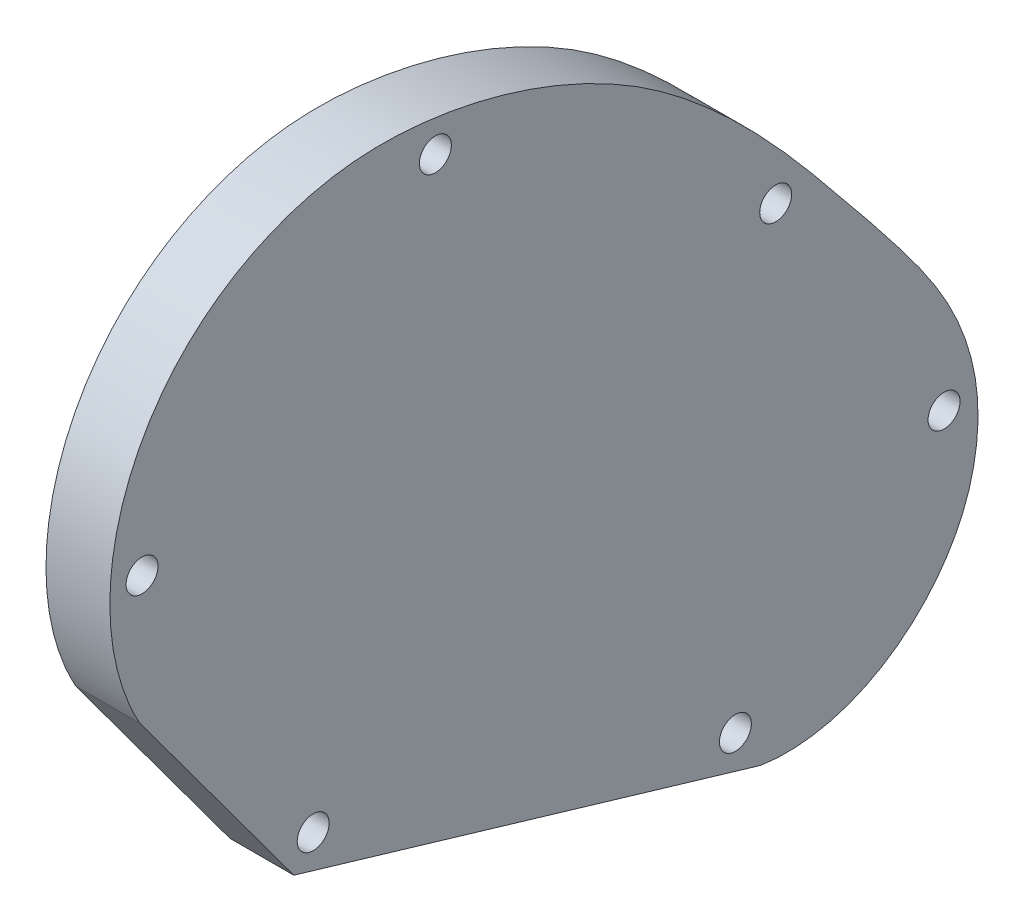
ISO-10303-21;
HEADER;
FILE_DESCRIPTION(('STEP AP214'),'2;1');
FILE_NAME('part.step','',(''),(''),'','','');
FILE_SCHEMA(('AUTOMOTIVE_DESIGN { 1 0 10303 214 1 1 1 1 }'));
ENDSEC;
DATA;
#1=APPLICATION_CONTEXT('core data for automotive mechanical design processes');
#2=APPLICATION_PROTOCOL_DEFINITION('international standard','automotive_design',2000,#1);
#3=PRODUCT_CONTEXT('',#1,'mechanical');
#4=PRODUCT('Part','Part','',(#3));
#5=PRODUCT_RELATED_PRODUCT_CATEGORY('part','',(#4));
#6=PRODUCT_DEFINITION_FORMATION('','',#4);
#7=PRODUCT_DEFINITION_CONTEXT('part definition',#1,'design');
#8=PRODUCT_DEFINITION('design','',#6,#7);
#9=PRODUCT_DEFINITION_SHAPE('','',#8);
#10=(LENGTH_UNIT() NAMED_UNIT(*) SI_UNIT(.MILLI.,.METRE.));
#11=(NAMED_UNIT(*) PLANE_ANGLE_UNIT() SI_UNIT($,.RADIAN.));
#12=(NAMED_UNIT(*) SI_UNIT($,.STERADIAN.) SOLID_ANGLE_UNIT());
#13=UNCERTAINTY_MEASURE_WITH_UNIT(LENGTH_MEASURE(1.E-05),#10,'distance_accuracy_value','');
#14=(GEOMETRIC_REPRESENTATION_CONTEXT(3) GLOBAL_UNCERTAINTY_ASSIGNED_CONTEXT((#13)) GLOBAL_UNIT_ASSIGNED_CONTEXT((#10,
#11,#12)) REPRESENTATION_CONTEXT('',''));
#15=CARTESIAN_POINT('',(0.,0.,0.));
#16=DIRECTION('',(0.,0.,1.));
#17=DIRECTION('',(1.,0.,0.));
#18=AXIS2_PLACEMENT_3D('',#15,#16,#17);
#19=CARTESIAN_POINT('',(5.08,0.233471834888237,-1.94960538058586));
#20=CARTESIAN_POINT('',(5.08,-0.232032838061737,-4.89029093835666));
#21=CARTESIAN_POINT('',(5.08,0.735147888287658,-10.1600715662072));
#22=CARTESIAN_POINT('',(5.08,5.14906723842943,-15.6119770122489));
#23=CARTESIAN_POINT('',(5.08,10.6470914606933,-18.8843682163243));
#24=CARTESIAN_POINT('',(5.08,17.2411640192682,-19.6740309190857));
#25=CARTESIAN_POINT('',(5.08,24.2161519129219,-17.4406350464242));
#26=CARTESIAN_POINT('',(5.08,30.1292096899761,-13.2325604281399));
#27=CARTESIAN_POINT('',(5.08,35.8985243797064,-8.55140179590255));
#28=CARTESIAN_POINT('',(5.08,41.6658940446074,-3.82762086595252));
#29=CARTESIAN_POINT('',(5.08,47.0271657049621,1.37076506832767));
#30=CARTESIAN_POINT('',(5.08,51.7970132804257,7.26123436451133));
#31=CARTESIAN_POINT('',(5.08,55.6982125354366,14.7784376004159));
#32=CARTESIAN_POINT('',(5.08,57.9925084552172,22.9520336139197));
#33=CARTESIAN_POINT('',(5.08,58.3344469981509,31.9743245823395));
#34=CARTESIAN_POINT('',(5.08,55.7107236303615,39.4706109309437));
#35=CARTESIAN_POINT('',(5.08,50.7737172579396,45.2723507155643));
#36=CARTESIAN_POINT('',(5.08,44.893993169829,48.7597786208499));
#37=CARTESIAN_POINT('',(5.08,36.8092568991045,50.4301454966565));
#38=CARTESIAN_POINT('',(5.08,30.9465623057775,49.1682550022707));
#39=CARTESIAN_POINT('',(5.08,27.8420746281139,47.4416683492837));
#40=B_SPLINE_CURVE_WITH_KNOTS('',3,(#19,#20,#21,#22,#23,#24,#25,#26,#27,#28,#29,#30,#31,#32,#33,
#34,#35,#36,#37,#38,#39),.UNSPECIFIED.,.F.,.F.,(4,1,1,1,1,1,1,1,1,1,1,1,1,1,1,1,1,1,4),(0.,
0.0646556292804893,0.112182170561428,0.149245604392294,0.202687260672012,0.251878753435343,
0.306377363823359,0.36071413963043,0.414932945263485,0.469634395682197,0.524171797785951,
0.580244220821397,0.65410555480733,0.70842118792978,0.775974657570874,0.822312065786156,
0.872983652165409,0.92283371866105,1.),.UNSPECIFIED.);
#41=DIRECTION('',(-1.,0.,0.));
#42=VECTOR('',#41,1.);
#43=SURFACE_OF_LINEAR_EXTRUSION('',#40,#42);
#44=CARTESIAN_POINT('',(0.,0.233471834888237,-1.94960538058586));
#45=CARTESIAN_POINT('',(0.,-0.232032838061737,-4.89029093835666));
#46=CARTESIAN_POINT('',(0.,0.735147888287658,-10.1600715662072));
#47=CARTESIAN_POINT('',(0.,5.14906723842943,-15.6119770122489));
#48=CARTESIAN_POINT('',(0.,10.6470914606933,-18.8843682163243));
#49=CARTESIAN_POINT('',(0.,17.2411640192682,-19.6740309190857));
#50=CARTESIAN_POINT('',(0.,24.2161519129219,-17.4406350464242));
#51=CARTESIAN_POINT('',(0.,30.1292096899761,-13.2325604281399));
#52=CARTESIAN_POINT('',(0.,35.8985243797064,-8.55140179590255));
#53=CARTESIAN_POINT('',(0.,41.6658940446074,-3.82762086595252));
#54=CARTESIAN_POINT('',(0.,47.0271657049621,1.37076506832767));
#55=CARTESIAN_POINT('',(0.,51.7970132804257,7.26123436451133));
#56=CARTESIAN_POINT('',(0.,55.6982125354366,14.7784376004159));
#57=CARTESIAN_POINT('',(0.,57.9925084552172,22.9520336139197));
#58=CARTESIAN_POINT('',(0.,58.3344469981509,31.9743245823395));
#59=CARTESIAN_POINT('',(0.,55.7107236303615,39.4706109309437));
#60=CARTESIAN_POINT('',(0.,50.7737172579396,45.2723507155643));
#61=CARTESIAN_POINT('',(0.,44.893993169829,48.7597786208499));
#62=CARTESIAN_POINT('',(0.,36.8092568991045,50.4301454966565));
#63=CARTESIAN_POINT('',(0.,30.9465623057775,49.1682550022707));
#64=CARTESIAN_POINT('',(0.,27.8420746281139,47.4416683492837));
#65=B_SPLINE_CURVE_WITH_KNOTS('',3,(#44,#45,#46,#47,#48,#49,#50,#51,#52,#53,#54,#55,#56,#57,#58,
#59,#60,#61,#62,#63,#64),.UNSPECIFIED.,.F.,.F.,(4,1,1,1,1,1,1,1,1,1,1,1,1,1,1,1,1,1,4),(0.,
0.0646556292804893,0.112182170561428,0.149245604392294,0.202687260672012,0.251878753435343,
0.306377363823359,0.36071413963043,0.414932945263485,0.469634395682197,0.524171797785951,
0.580244220821397,0.65410555480733,0.70842118792978,0.775974657570874,0.822312065786156,
0.872983652165409,0.92283371866105,1.),.UNSPECIFIED.);
#66=CARTESIAN_POINT('',(0.,0.233471834888237,-1.94960538058586));
#67=VERTEX_POINT('',#66);
#68=CARTESIAN_POINT('',(0.,27.8420746281139,47.4416683492837));
#69=VERTEX_POINT('',#68);
#70=EDGE_CURVE('E89',#67,#69,#65,.T.);
#71=ORIENTED_EDGE('',*,*,#70,.T.);
#72=DIRECTION('',(-1.,0.,0.));
#73=VECTOR('',#72,1.);
#74=CARTESIAN_POINT('',(5.08,27.8420746281139,47.4416683492837));
#75=LINE('',#74,#73);
#76=CARTESIAN_POINT('',(5.08,27.8420746281139,47.4416683492837));
#77=VERTEX_POINT('',#76);
#78=EDGE_CURVE('E11',#77,#69,#75,.T.);
#79=ORIENTED_EDGE('',*,*,#78,.F.);
#80=CARTESIAN_POINT('',(5.08,0.233471834888237,-1.94960538058586));
#81=VERTEX_POINT('',#80);
#82=EDGE_CURVE('E82',#81,#77,#40,.T.);
#83=ORIENTED_EDGE('',*,*,#82,.F.);
#84=DIRECTION('',(-1.,0.,0.));
#85=VECTOR('',#84,1.);
#86=CARTESIAN_POINT('',(5.08,0.233471834888237,-1.94960538058586));
#87=LINE('',#86,#85);
#88=EDGE_CURVE('E90',#81,#67,#87,.T.);
#89=ORIENTED_EDGE('',*,*,#88,.T.);
#90=EDGE_LOOP('',(#71,#79,#83,#89));
#91=FACE_BOUND('',#90,.T.);
#92=ADVANCED_FACE('F39',(#91),#43,.F.);
#93=CARTESIAN_POINT('',(5.08,27.8420746281139,47.4416683492837));
#94=DIRECTION('',(0.,0.593840213906376,-0.804582997799251));
#95=DIRECTION('',(0.,0.804582997799251,0.593840213906376));
#96=AXIS2_PLACEMENT_3D('',#93,#94,#95);
#97=PLANE('',#96);
#98=DIRECTION('',(0.,-0.804582997799251,-0.593840213906376));
#99=VECTOR('',#98,1.);
#100=CARTESIAN_POINT('',(0.,27.8420746281139,47.4416683492837));
#101=LINE('',#100,#99);
#102=CARTESIAN_POINT('',(0.,11.2313167526906,35.1817324112022));
#103=VERTEX_POINT('',#102);
#104=EDGE_CURVE('E69',#69,#103,#101,.T.);
#105=ORIENTED_EDGE('',*,*,#104,.T.);
#106=DIRECTION('',(-1.,0.,0.));
#107=VECTOR('',#106,1.);
#108=CARTESIAN_POINT('',(5.08,11.2313167526906,35.1817324112022));
#109=LINE('',#108,#107);
#110=CARTESIAN_POINT('',(5.08,11.2313167526906,35.1817324112022));
#111=VERTEX_POINT('',#110);
#112=EDGE_CURVE('E49',#111,#103,#109,.T.);
#113=ORIENTED_EDGE('',*,*,#112,.F.);
#114=DIRECTION('',(0.,-0.804582997799251,-0.593840213906376));
#115=VECTOR('',#114,1.);
#116=CARTESIAN_POINT('',(5.08,27.8420746281139,47.4416683492837));
#117=LINE('',#116,#115);
#118=EDGE_CURVE('E77',#77,#111,#117,.T.);
#119=ORIENTED_EDGE('',*,*,#118,.F.);
#120=ORIENTED_EDGE('',*,*,#78,.T.);
#121=EDGE_LOOP('',(#105,#113,#119,#120));
#122=FACE_BOUND('',#121,.T.);
#123=ADVANCED_FACE('F78',(#122),#97,.F.);
#124=CARTESIAN_POINT('',(5.08,11.2313167526906,35.1817324112022));
#125=DIRECTION('',(0.,0.958826474212149,-0.283992592068701));
#126=DIRECTION('',(0.,0.283992592068701,0.958826474212149));
#127=AXIS2_PLACEMENT_3D('',#124,#125,#126);
#128=PLANE('',#127);
#129=DIRECTION('',(0.,-0.283992592068701,-0.958826474212149));
#130=VECTOR('',#129,1.);
#131=CARTESIAN_POINT('',(0.,11.2313167526906,35.1817324112022));
#132=LINE('',#131,#130);
#133=EDGE_CURVE('E74',#103,#67,#132,.T.);
#134=ORIENTED_EDGE('',*,*,#133,.T.);
#135=ORIENTED_EDGE('',*,*,#88,.F.);
#136=DIRECTION('',(0.,-0.283992592068701,-0.958826474212149));
#137=VECTOR('',#136,1.);
#138=CARTESIAN_POINT('',(5.08,11.2313167526906,35.1817324112022));
#139=LINE('',#138,#137);
#140=EDGE_CURVE('E57',#111,#81,#139,.T.);
#141=ORIENTED_EDGE('',*,*,#140,.F.);
#142=ORIENTED_EDGE('',*,*,#112,.T.);
#143=EDGE_LOOP('',(#134,#135,#141,#142));
#144=FACE_BOUND('',#143,.T.);
#145=ADVANCED_FACE('F112',(#144),#128,.F.);
#146=CARTESIAN_POINT('',(5.08,49.6152633674236,4.65545784313134));
#147=DIRECTION('',(-1.,0.,0.));
#148=DIRECTION('',(0.,0.,1.));
#149=AXIS2_PLACEMENT_3D('',#146,#147,#148);
#150=PLANE('',#149);
#151=CARTESIAN_POINT('',(5.08,3.47984023044257,0.0670104703112806));
#152=DIRECTION('',(-1.,0.,0.));
#153=DIRECTION('',(0.,0.,1.));
#154=AXIS2_PLACEMENT_3D('',#151,#152,#153);
#155=CIRCLE('',#154,1.27);
#156=CARTESIAN_POINT('',(5.08,3.47984023044257,1.33701047031128));
#157=VERTEX_POINT('',#156);
#158=EDGE_CURVE('E209',#157,#157,#155,.T.);
#159=ORIENTED_EDGE('',*,*,#158,.T.);
#160=EDGE_LOOP('',(#159));
#161=FACE_BOUND('',#160,.T.);
#162=CARTESIAN_POINT('',(5.08,17.3753847853446,-16.5258591219544));
#163=DIRECTION('',(-1.,0.,0.));
#164=DIRECTION('',(0.,0.,1.));
#165=AXIS2_PLACEMENT_3D('',#162,#163,#164);
#166=CIRCLE('',#165,1.27);
#167=CARTESIAN_POINT('',(5.08,17.3753847853446,-15.2558591219544));
#168=VERTEX_POINT('',#167);
#169=EDGE_CURVE('E256',#168,#168,#166,.T.);
#170=ORIENTED_EDGE('',*,*,#169,.T.);
#171=EDGE_LOOP('',(#170));
#172=FACE_BOUND('',#171,.T.);
#173=CARTESIAN_POINT('',(5.08,38.3448340073076,-3.13806032194229));
#174=DIRECTION('',(-1.,0.,0.));
#175=DIRECTION('',(0.,0.,1.));
#176=AXIS2_PLACEMENT_3D('',#173,#174,#175);
#177=CIRCLE('',#176,1.27);
#178=CARTESIAN_POINT('',(5.08,38.3448340073076,-1.86806032194229));
#179=VERTEX_POINT('',#178);
#180=EDGE_CURVE('E248',#179,#179,#177,.T.);
#181=ORIENTED_EDGE('',*,*,#180,.T.);
#182=EDGE_LOOP('',(#181));
#183=FACE_BOUND('',#182,.T.);
#184=CARTESIAN_POINT('',(5.08,55.2562820120933,23.9253504218282));
#185=DIRECTION('',(-1.,0.,0.));
#186=DIRECTION('',(0.,0.,1.));
#187=AXIS2_PLACEMENT_3D('',#184,#185,#186);
#188=CIRCLE('',#187,1.27);
#189=CARTESIAN_POINT('',(5.08,55.2562820120933,25.1953504218282));
#190=VERTEX_POINT('',#189);
#191=EDGE_CURVE('E238',#190,#190,#188,.T.);
#192=ORIENTED_EDGE('',*,*,#191,.T.);
#193=EDGE_LOOP('',(#192));
#194=FACE_BOUND('',#193,.T.);
#195=CARTESIAN_POINT('',(5.08,37.9218474057265,47.2526726411358));
#196=DIRECTION('',(-1.,0.,0.));
#197=DIRECTION('',(0.,0.,1.));
#198=AXIS2_PLACEMENT_3D('',#195,#196,#197);
#199=CIRCLE('',#198,1.27);
#200=CARTESIAN_POINT('',(5.08,37.9218474057265,48.5226726411358));
#201=VERTEX_POINT('',#200);
#202=EDGE_CURVE('E221',#201,#201,#199,.T.);
#203=ORIENTED_EDGE('',*,*,#202,.T.);
#204=EDGE_LOOP('',(#203));
#205=FACE_BOUND('',#204,.T.);
#206=CARTESIAN_POINT('',(5.08,13.4248790020941,33.6438245409367));
#207=DIRECTION('',(-1.,0.,0.));
#208=DIRECTION('',(0.,0.,1.));
#209=AXIS2_PLACEMENT_3D('',#206,#207,#208);
#210=CIRCLE('',#209,1.27);
#211=CARTESIAN_POINT('',(5.08,13.4248790020941,34.9138245409367));
#212=VERTEX_POINT('',#211);
#213=EDGE_CURVE('E93',#212,#212,#210,.T.);
#214=ORIENTED_EDGE('',*,*,#213,.T.);
#215=EDGE_LOOP('',(#214));
#216=FACE_BOUND('',#215,.T.);
#217=ORIENTED_EDGE('',*,*,#82,.T.);
#218=ORIENTED_EDGE('',*,*,#118,.T.);
#219=ORIENTED_EDGE('',*,*,#140,.T.);
#220=EDGE_LOOP('',(#217,#218,#219));
#221=FACE_BOUND('',#220,.T.);
#222=ADVANCED_FACE('F85',(#161,#172,#183,#194,#205,#216,#221),#150,.F.);
#223=CARTESIAN_POINT('',(0.,49.6152633674236,4.65545784313134));
#224=DIRECTION('',(-1.,0.,0.));
#225=DIRECTION('',(0.,0.,1.));
#226=AXIS2_PLACEMENT_3D('',#223,#224,#225);
#227=PLANE('',#226);
#228=CARTESIAN_POINT('',(0.,3.47984023044257,0.0670104703112806));
#229=DIRECTION('',(-1.,0.,0.));
#230=DIRECTION('',(0.,0.,1.));
#231=AXIS2_PLACEMENT_3D('',#228,#229,#230);
#232=CIRCLE('',#231,1.27);
#233=CARTESIAN_POINT('',(0.,3.47984023044257,1.33701047031128));
#234=VERTEX_POINT('',#233);
#235=EDGE_CURVE('E211',#234,#234,#232,.T.);
#236=ORIENTED_EDGE('',*,*,#235,.F.);
#237=EDGE_LOOP('',(#236));
#238=FACE_BOUND('',#237,.T.);
#239=CARTESIAN_POINT('',(0.,17.3753847853446,-16.5258591219544));
#240=DIRECTION('',(-1.,0.,0.));
#241=DIRECTION('',(0.,0.,1.));
#242=AXIS2_PLACEMENT_3D('',#239,#240,#241);
#243=CIRCLE('',#242,1.27);
#244=CARTESIAN_POINT('',(0.,17.3753847853446,-15.2558591219544));
#245=VERTEX_POINT('',#244);
#246=EDGE_CURVE('E215',#245,#245,#243,.T.);
#247=ORIENTED_EDGE('',*,*,#246,.F.);
#248=EDGE_LOOP('',(#247));
#249=FACE_BOUND('',#248,.T.);
#250=CARTESIAN_POINT('',(0.,38.3448340073076,-3.13806032194229));
#251=DIRECTION('',(-1.,0.,0.));
#252=DIRECTION('',(0.,0.,1.));
#253=AXIS2_PLACEMENT_3D('',#250,#251,#252);
#254=CIRCLE('',#253,1.27);
#255=CARTESIAN_POINT('',(0.,38.3448340073076,-1.86806032194229));
#256=VERTEX_POINT('',#255);
#257=EDGE_CURVE('E252',#256,#256,#254,.T.);
#258=ORIENTED_EDGE('',*,*,#257,.F.);
#259=EDGE_LOOP('',(#258));
#260=FACE_BOUND('',#259,.T.);
#261=CARTESIAN_POINT('',(0.,55.2562820120933,23.9253504218282));
#262=DIRECTION('',(-1.,0.,0.));
#263=DIRECTION('',(0.,0.,1.));
#264=AXIS2_PLACEMENT_3D('',#261,#262,#263);
#265=CIRCLE('',#264,1.27);
#266=CARTESIAN_POINT('',(0.,55.2562820120933,25.1953504218282));
#267=VERTEX_POINT('',#266);
#268=EDGE_CURVE('E244',#267,#267,#265,.T.);
#269=ORIENTED_EDGE('',*,*,#268,.F.);
#270=EDGE_LOOP('',(#269));
#271=FACE_BOUND('',#270,.T.);
#272=CARTESIAN_POINT('',(0.,37.9218474057265,47.2526726411358));
#273=DIRECTION('',(-1.,0.,0.));
#274=DIRECTION('',(0.,0.,1.));
#275=AXIS2_PLACEMENT_3D('',#272,#273,#274);
#276=CIRCLE('',#275,1.27);
#277=CARTESIAN_POINT('',(0.,37.9218474057265,48.5226726411358));
#278=VERTEX_POINT('',#277);
#279=EDGE_CURVE('E232',#278,#278,#276,.T.);
#280=ORIENTED_EDGE('',*,*,#279,.F.);
#281=EDGE_LOOP('',(#280));
#282=FACE_BOUND('',#281,.T.);
#283=CARTESIAN_POINT('',(0.,13.4248790020941,33.6438245409367));
#284=DIRECTION('',(-1.,0.,0.));
#285=DIRECTION('',(0.,0.,1.));
#286=AXIS2_PLACEMENT_3D('',#283,#284,#285);
#287=CIRCLE('',#286,1.27);
#288=CARTESIAN_POINT('',(0.,13.4248790020941,34.9138245409367));
#289=VERTEX_POINT('',#288);
#290=EDGE_CURVE('E99',#289,#289,#287,.T.);
#291=ORIENTED_EDGE('',*,*,#290,.F.);
#292=EDGE_LOOP('',(#291));
#293=FACE_BOUND('',#292,.T.);
#294=ORIENTED_EDGE('',*,*,#70,.F.);
#295=ORIENTED_EDGE('',*,*,#133,.F.);
#296=ORIENTED_EDGE('',*,*,#104,.F.);
#297=EDGE_LOOP('',(#294,#295,#296));
#298=FACE_BOUND('',#297,.T.);
#299=ADVANCED_FACE('F113',(#238,#249,#260,#271,#282,#293,#298),#227,.T.);
#300=CARTESIAN_POINT('',(5.08,13.4248790020941,33.6438245409367));
#301=DIRECTION('',(-1.,0.,0.));
#302=DIRECTION('',(0.,0.,1.));
#303=AXIS2_PLACEMENT_3D('',#300,#301,#302);
#304=CYLINDRICAL_SURFACE('',#303,1.27);
#305=ORIENTED_EDGE('',*,*,#213,.F.);
#306=EDGE_LOOP('',(#305));
#307=FACE_BOUND('',#306,.T.);
#308=ORIENTED_EDGE('',*,*,#290,.T.);
#309=EDGE_LOOP('',(#308));
#310=FACE_BOUND('',#309,.T.);
#311=ADVANCED_FACE('F115',(#307,#310),#304,.F.);
#312=CARTESIAN_POINT('',(5.08,37.9218474057265,47.2526726411358));
#313=DIRECTION('',(-1.,0.,0.));
#314=DIRECTION('',(0.,0.,1.));
#315=AXIS2_PLACEMENT_3D('',#312,#313,#314);
#316=CYLINDRICAL_SURFACE('',#315,1.27);
#317=ORIENTED_EDGE('',*,*,#202,.F.);
#318=EDGE_LOOP('',(#317));
#319=FACE_BOUND('',#318,.T.);
#320=ORIENTED_EDGE('',*,*,#279,.T.);
#321=EDGE_LOOP('',(#320));
#322=FACE_BOUND('',#321,.T.);
#323=ADVANCED_FACE('F122',(#319,#322),#316,.F.);
#324=CARTESIAN_POINT('',(5.08,55.2562820120933,23.9253504218282));
#325=DIRECTION('',(-1.,0.,0.));
#326=DIRECTION('',(0.,0.,1.));
#327=AXIS2_PLACEMENT_3D('',#324,#325,#326);
#328=CYLINDRICAL_SURFACE('',#327,1.27);
#329=ORIENTED_EDGE('',*,*,#191,.F.);
#330=EDGE_LOOP('',(#329));
#331=FACE_BOUND('',#330,.T.);
#332=ORIENTED_EDGE('',*,*,#268,.T.);
#333=EDGE_LOOP('',(#332));
#334=FACE_BOUND('',#333,.T.);
#335=ADVANCED_FACE('F162',(#331,#334),#328,.F.);
#336=CARTESIAN_POINT('',(5.08,38.3448340073076,-3.13806032194229));
#337=DIRECTION('',(-1.,0.,0.));
#338=DIRECTION('',(0.,0.,1.));
#339=AXIS2_PLACEMENT_3D('',#336,#337,#338);
#340=CYLINDRICAL_SURFACE('',#339,1.27);
#341=ORIENTED_EDGE('',*,*,#180,.F.);
#342=EDGE_LOOP('',(#341));
#343=FACE_BOUND('',#342,.T.);
#344=ORIENTED_EDGE('',*,*,#257,.T.);
#345=EDGE_LOOP('',(#344));
#346=FACE_BOUND('',#345,.T.);
#347=ADVANCED_FACE('F172',(#343,#346),#340,.F.);
#348=CARTESIAN_POINT('',(5.08,17.3753847853446,-16.5258591219544));
#349=DIRECTION('',(-1.,0.,0.));
#350=DIRECTION('',(0.,0.,1.));
#351=AXIS2_PLACEMENT_3D('',#348,#349,#350);
#352=CYLINDRICAL_SURFACE('',#351,1.27);
#353=ORIENTED_EDGE('',*,*,#169,.F.);
#354=EDGE_LOOP('',(#353));
#355=FACE_BOUND('',#354,.T.);
#356=ORIENTED_EDGE('',*,*,#246,.T.);
#357=EDGE_LOOP('',(#356));
#358=FACE_BOUND('',#357,.T.);
#359=ADVANCED_FACE('F182',(#355,#358),#352,.F.);
#360=CARTESIAN_POINT('',(5.08,3.47984023044257,0.0670104703112806));
#361=DIRECTION('',(-1.,0.,0.));
#362=DIRECTION('',(0.,0.,1.));
#363=AXIS2_PLACEMENT_3D('',#360,#361,#362);
#364=CYLINDRICAL_SURFACE('',#363,1.27);
#365=ORIENTED_EDGE('',*,*,#158,.F.);
#366=EDGE_LOOP('',(#365));
#367=FACE_BOUND('',#366,.T.);
#368=ORIENTED_EDGE('',*,*,#235,.T.);
#369=EDGE_LOOP('',(#368));
#370=FACE_BOUND('',#369,.T.);
#371=ADVANCED_FACE('F192',(#367,#370),#364,.F.);
#372=CLOSED_SHELL('',(#92,#123,#145,#222,#299,#311,#323,#335,#347,#359,#371));
#373=MANIFOLD_SOLID_BREP('B2',#372);
#374=ADVANCED_BREP_SHAPE_REPRESENTATION('',(#18,#373),#14);
#375=SHAPE_DEFINITION_REPRESENTATION(#9,#374);
ENDSEC;
END-ISO-10303-21;
